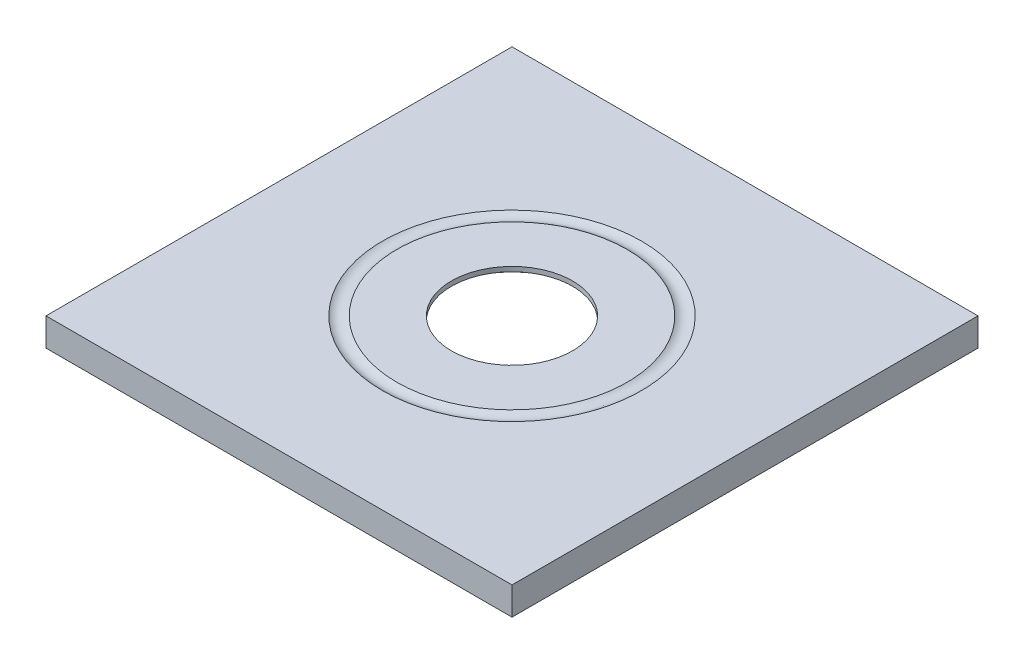
ISO-10303-21;
HEADER;
FILE_DESCRIPTION(('STEP AP214'),'2;1');
FILE_NAME('part.step','',(''),(''),'','','');
FILE_SCHEMA(('AUTOMOTIVE_DESIGN { 1 0 10303 214 1 1 1 1 }'));
ENDSEC;
DATA;
#1=APPLICATION_CONTEXT('core data for automotive mechanical design processes');
#2=APPLICATION_PROTOCOL_DEFINITION('international standard','automotive_design',2000,#1);
#3=PRODUCT_CONTEXT('',#1,'mechanical');
#4=PRODUCT('Part','Part','',(#3));
#5=PRODUCT_RELATED_PRODUCT_CATEGORY('part','',(#4));
#6=PRODUCT_DEFINITION_FORMATION('','',#4);
#7=PRODUCT_DEFINITION_CONTEXT('part definition',#1,'design');
#8=PRODUCT_DEFINITION('design','',#6,#7);
#9=PRODUCT_DEFINITION_SHAPE('','',#8);
#10=(LENGTH_UNIT() NAMED_UNIT(*) SI_UNIT(.MILLI.,.METRE.));
#11=(NAMED_UNIT(*) PLANE_ANGLE_UNIT() SI_UNIT($,.RADIAN.));
#12=(NAMED_UNIT(*) SI_UNIT($,.STERADIAN.) SOLID_ANGLE_UNIT());
#13=UNCERTAINTY_MEASURE_WITH_UNIT(LENGTH_MEASURE(1.E-05),#10,'distance_accuracy_value','');
#14=(GEOMETRIC_REPRESENTATION_CONTEXT(3) GLOBAL_UNCERTAINTY_ASSIGNED_CONTEXT((#13)) GLOBAL_UNIT_ASSIGNED_CONTEXT((#10,
#11,#12)) REPRESENTATION_CONTEXT('',''));
#15=CARTESIAN_POINT('',(0.,0.,0.));
#16=DIRECTION('',(0.,0.,1.));
#17=DIRECTION('',(1.,0.,0.));
#18=AXIS2_PLACEMENT_3D('',#15,#16,#17);
#19=CARTESIAN_POINT('',(0.,0.,0.));
#20=DIRECTION('',(0.,1.,0.));
#21=DIRECTION('',(0.,0.,1.));
#22=AXIS2_PLACEMENT_3D('',#19,#20,#21);
#23=CYLINDRICAL_SURFACE('',#22,40.);
#24=CARTESIAN_POINT('',(0.,-8.,0.));
#25=DIRECTION('',(0.,1.,0.));
#26=DIRECTION('',(0.,0.,1.));
#27=AXIS2_PLACEMENT_3D('',#24,#25,#26);
#28=CIRCLE('',#27,40.);
#29=CARTESIAN_POINT('',(0.,-8.,40.));
#30=VERTEX_POINT('',#29);
#31=EDGE_CURVE('E113',#30,#30,#28,.T.);
#32=ORIENTED_EDGE('',*,*,#31,.F.);
#33=EDGE_LOOP('',(#32));
#34=FACE_BOUND('',#33,.T.);
#35=CARTESIAN_POINT('',(1.69869538983426E-11,2.,-1.64294814736717E-11));
#36=DIRECTION('',(0.,1.,0.));
#37=DIRECTION('',(0.,0.,1.));
#38=AXIS2_PLACEMENT_3D('',#35,#36,#37);
#39=CIRCLE('',#38,40.0000000000173);
#40=CARTESIAN_POINT('',(1.69869538983426E-11,2.,40.0000000000009));
#41=VERTEX_POINT('',#40);
#42=EDGE_CURVE('E107',#41,#41,#39,.T.);
#43=ORIENTED_EDGE('',*,*,#42,.T.);
#44=EDGE_LOOP('',(#43));
#45=FACE_BOUND('',#44,.T.);
#46=ADVANCED_FACE('F34',(#34,#45),#23,.F.);
#47=CARTESIAN_POINT('',(49.4043,4.,0.));
#48=DIRECTION('',(0.,1.,0.));
#49=DIRECTION('',(0.,0.,1.));
#50=AXIS2_PLACEMENT_3D('',#47,#48,#49);
#51=PLANE('',#50);
#52=CARTESIAN_POINT('',(0.,4.,0.));
#53=DIRECTION('',(0.,1.,0.));
#54=DIRECTION('',(0.,0.,1.));
#55=AXIS2_PLACEMENT_3D('',#52,#53,#54);
#56=CIRCLE('',#55,49.4043);
#57=CARTESIAN_POINT('',(0.,4.,49.4043));
#58=VERTEX_POINT('',#57);
#59=EDGE_CURVE('E11',#58,#58,#56,.T.);
#60=ORIENTED_EDGE('',*,*,#59,.T.);
#61=EDGE_LOOP('',(#60));
#62=FACE_BOUND('',#61,.T.);
#63=CARTESIAN_POINT('',(1.69869538983426E-11,4.,-1.64294814736717E-11));
#64=DIRECTION('',(0.,1.,0.));
#65=DIRECTION('',(0.,0.,1.));
#66=AXIS2_PLACEMENT_3D('',#63,#64,#65);
#67=CIRCLE('',#66,26.);
#68=CARTESIAN_POINT('',(1.69869538983426E-11,4.,25.9999999999836));
#69=VERTEX_POINT('',#68);
#70=EDGE_CURVE('E245',#69,#69,#67,.T.);
#71=ORIENTED_EDGE('',*,*,#70,.F.);
#72=EDGE_LOOP('',(#71));
#73=FACE_BOUND('',#72,.T.);
#74=ADVANCED_FACE('F36',(#62,#73),#51,.T.);
#75=CARTESIAN_POINT('',(0.,8.11571883271926,0.));
#76=DIRECTION('',(0.,1.,0.));
#77=DIRECTION('',(0.,0.,1.));
#78=AXIS2_PLACEMENT_3D('',#75,#76,#77);
#79=TOROIDAL_SURFACE('',#78,52.5,5.15);
#80=CARTESIAN_POINT('',(0.,4.,0.));
#81=DIRECTION('',(0.,1.,0.));
#82=DIRECTION('',(0.,0.,1.));
#83=AXIS2_PLACEMENT_3D('',#80,#81,#82);
#84=CIRCLE('',#83,55.5957);
#85=CARTESIAN_POINT('',(0.,4.,55.5957));
#86=VERTEX_POINT('',#85);
#87=EDGE_CURVE('E43',#86,#86,#84,.T.);
#88=ORIENTED_EDGE('',*,*,#87,.T.);
#89=EDGE_LOOP('',(#88));
#90=FACE_BOUND('',#89,.T.);
#91=ORIENTED_EDGE('',*,*,#59,.F.);
#92=EDGE_LOOP('',(#91));
#93=FACE_BOUND('',#92,.T.);
#94=ADVANCED_FACE('F126',(#90,#93),#79,.F.);
#95=CARTESIAN_POINT('',(60.,4.,0.));
#96=DIRECTION('',(0.,1.,0.));
#97=DIRECTION('',(0.,0.,1.));
#98=AXIS2_PLACEMENT_3D('',#95,#96,#97);
#99=PLANE('',#98);
#100=ORIENTED_EDGE('',*,*,#87,.F.);
#101=EDGE_LOOP('',(#100));
#102=FACE_BOUND('',#101,.T.);
#103=DIRECTION('',(0.,0.,-1.));
#104=VECTOR('',#103,1.);
#105=CARTESIAN_POINT('',(100.,4.,-100.));
#106=LINE('',#105,#104);
#107=CARTESIAN_POINT('',(100.,4.,100.));
#108=VERTEX_POINT('',#107);
#109=CARTESIAN_POINT('',(100.,4.,-100.));
#110=VERTEX_POINT('',#109);
#111=EDGE_CURVE('E103',#108,#110,#106,.T.);
#112=ORIENTED_EDGE('',*,*,#111,.T.);
#113=DIRECTION('',(-1.,0.,0.));
#114=VECTOR('',#113,1.);
#115=CARTESIAN_POINT('',(-100.,4.,-100.));
#116=LINE('',#115,#114);
#117=CARTESIAN_POINT('',(-100.,4.,-100.));
#118=VERTEX_POINT('',#117);
#119=EDGE_CURVE('E106',#110,#118,#116,.T.);
#120=ORIENTED_EDGE('',*,*,#119,.T.);
#121=DIRECTION('',(0.,0.,1.));
#122=VECTOR('',#121,1.);
#123=CARTESIAN_POINT('',(-100.,4.,-100.));
#124=LINE('',#123,#122);
#125=CARTESIAN_POINT('',(-100.,4.,100.));
#126=VERTEX_POINT('',#125);
#127=EDGE_CURVE('E87',#118,#126,#124,.T.);
#128=ORIENTED_EDGE('',*,*,#127,.T.);
#129=DIRECTION('',(1.,0.,0.));
#130=VECTOR('',#129,1.);
#131=CARTESIAN_POINT('',(-100.,4.,100.));
#132=LINE('',#131,#130);
#133=EDGE_CURVE('E98',#126,#108,#132,.T.);
#134=ORIENTED_EDGE('',*,*,#133,.T.);
#135=EDGE_LOOP('',(#112,#120,#128,#134));
#136=FACE_BOUND('',#135,.T.);
#137=ADVANCED_FACE('F129',(#102,#136),#99,.T.);
#138=CARTESIAN_POINT('',(55.5957,-8.,0.));
#139=DIRECTION('',(0.,-1.,0.));
#140=DIRECTION('',(0.,0.,-1.));
#141=AXIS2_PLACEMENT_3D('',#138,#139,#140);
#142=PLANE('',#141);
#143=CARTESIAN_POINT('',(0.,-8.,0.));
#144=DIRECTION('',(0.,1.,0.));
#145=DIRECTION('',(0.,0.,1.));
#146=AXIS2_PLACEMENT_3D('',#143,#144,#145);
#147=CIRCLE('',#146,55.5957);
#148=CARTESIAN_POINT('',(0.,-8.,55.5957));
#149=VERTEX_POINT('',#148);
#150=EDGE_CURVE('E121',#149,#149,#147,.T.);
#151=ORIENTED_EDGE('',*,*,#150,.T.);
#152=EDGE_LOOP('',(#151));
#153=FACE_BOUND('',#152,.T.);
#154=DIRECTION('',(0.,0.,-1.));
#155=VECTOR('',#154,1.);
#156=CARTESIAN_POINT('',(100.,-8.,-100.));
#157=LINE('',#156,#155);
#158=CARTESIAN_POINT('',(100.,-8.,100.));
#159=VERTEX_POINT('',#158);
#160=CARTESIAN_POINT('',(100.,-8.,-100.));
#161=VERTEX_POINT('',#160);
#162=EDGE_CURVE('E96',#159,#161,#157,.T.);
#163=ORIENTED_EDGE('',*,*,#162,.F.);
#164=DIRECTION('',(1.,0.,0.));
#165=VECTOR('',#164,1.);
#166=CARTESIAN_POINT('',(-100.,-8.,100.));
#167=LINE('',#166,#165);
#168=CARTESIAN_POINT('',(-100.,-8.,100.));
#169=VERTEX_POINT('',#168);
#170=EDGE_CURVE('E93',#169,#159,#167,.T.);
#171=ORIENTED_EDGE('',*,*,#170,.F.);
#172=DIRECTION('',(0.,0.,1.));
#173=VECTOR('',#172,1.);
#174=CARTESIAN_POINT('',(-100.,-8.,-100.));
#175=LINE('',#174,#173);
#176=CARTESIAN_POINT('',(-100.,-8.,-100.));
#177=VERTEX_POINT('',#176);
#178=EDGE_CURVE('E85',#177,#169,#175,.T.);
#179=ORIENTED_EDGE('',*,*,#178,.F.);
#180=DIRECTION('',(-1.,0.,0.));
#181=VECTOR('',#180,1.);
#182=CARTESIAN_POINT('',(-100.,-8.,-100.));
#183=LINE('',#182,#181);
#184=EDGE_CURVE('E92',#161,#177,#183,.T.);
#185=ORIENTED_EDGE('',*,*,#184,.F.);
#186=EDGE_LOOP('',(#163,#171,#179,#185));
#187=FACE_BOUND('',#186,.T.);
#188=ADVANCED_FACE('F91',(#153,#187),#142,.T.);
#189=CARTESIAN_POINT('',(0.,-12.1157188327193,0.));
#190=DIRECTION('',(0.,1.,0.));
#191=DIRECTION('',(0.,0.,1.));
#192=AXIS2_PLACEMENT_3D('',#189,#190,#191);
#193=TOROIDAL_SURFACE('',#192,52.5,5.15);
#194=CARTESIAN_POINT('',(0.,-8.,0.));
#195=DIRECTION('',(0.,1.,0.));
#196=DIRECTION('',(0.,0.,1.));
#197=AXIS2_PLACEMENT_3D('',#194,#195,#196);
#198=CIRCLE('',#197,49.4043);
#199=CARTESIAN_POINT('',(0.,-8.,49.4043));
#200=VERTEX_POINT('',#199);
#201=EDGE_CURVE('E118',#200,#200,#198,.T.);
#202=ORIENTED_EDGE('',*,*,#201,.T.);
#203=EDGE_LOOP('',(#202));
#204=FACE_BOUND('',#203,.T.);
#205=ORIENTED_EDGE('',*,*,#150,.F.);
#206=EDGE_LOOP('',(#205));
#207=FACE_BOUND('',#206,.T.);
#208=ADVANCED_FACE('F158',(#204,#207),#193,.F.);
#209=CARTESIAN_POINT('',(40.,-8.,0.));
#210=DIRECTION('',(0.,-1.,0.));
#211=DIRECTION('',(0.,0.,-1.));
#212=AXIS2_PLACEMENT_3D('',#209,#210,#211);
#213=PLANE('',#212);
#214=ORIENTED_EDGE('',*,*,#31,.T.);
#215=EDGE_LOOP('',(#214));
#216=FACE_BOUND('',#215,.T.);
#217=ORIENTED_EDGE('',*,*,#201,.F.);
#218=EDGE_LOOP('',(#217));
#219=FACE_BOUND('',#218,.T.);
#220=ADVANCED_FACE('F142',(#216,#219),#213,.T.);
#221=CARTESIAN_POINT('',(100.,-8.,-100.));
#222=DIRECTION('',(1.,0.,0.));
#223=DIRECTION('',(0.,0.,-1.));
#224=AXIS2_PLACEMENT_3D('',#221,#222,#223);
#225=PLANE('',#224);
#226=ORIENTED_EDGE('',*,*,#111,.F.);
#227=DIRECTION('',(0.,1.,0.));
#228=VECTOR('',#227,1.);
#229=CARTESIAN_POINT('',(100.,-8.,100.));
#230=LINE('',#229,#228);
#231=EDGE_CURVE('E51',#159,#108,#230,.T.);
#232=ORIENTED_EDGE('',*,*,#231,.F.);
#233=ORIENTED_EDGE('',*,*,#162,.T.);
#234=DIRECTION('',(0.,1.,0.));
#235=VECTOR('',#234,1.);
#236=CARTESIAN_POINT('',(100.,-8.,-100.));
#237=LINE('',#236,#235);
#238=EDGE_CURVE('E79',#161,#110,#237,.T.);
#239=ORIENTED_EDGE('',*,*,#238,.T.);
#240=EDGE_LOOP('',(#226,#232,#233,#239));
#241=FACE_BOUND('',#240,.T.);
#242=ADVANCED_FACE('F133',(#241),#225,.T.);
#243=CARTESIAN_POINT('',(-100.,-8.,100.));
#244=DIRECTION('',(0.,0.,1.));
#245=DIRECTION('',(1.,0.,0.));
#246=AXIS2_PLACEMENT_3D('',#243,#244,#245);
#247=PLANE('',#246);
#248=ORIENTED_EDGE('',*,*,#133,.F.);
#249=DIRECTION('',(0.,1.,0.));
#250=VECTOR('',#249,1.);
#251=CARTESIAN_POINT('',(-100.,-8.,100.));
#252=LINE('',#251,#250);
#253=EDGE_CURVE('E68',#169,#126,#252,.T.);
#254=ORIENTED_EDGE('',*,*,#253,.F.);
#255=ORIENTED_EDGE('',*,*,#170,.T.);
#256=ORIENTED_EDGE('',*,*,#231,.T.);
#257=EDGE_LOOP('',(#248,#254,#255,#256));
#258=FACE_BOUND('',#257,.T.);
#259=ADVANCED_FACE('F134',(#258),#247,.T.);
#260=CARTESIAN_POINT('',(-100.,-8.,-100.));
#261=DIRECTION('',(-1.,0.,0.));
#262=DIRECTION('',(0.,0.,1.));
#263=AXIS2_PLACEMENT_3D('',#260,#261,#262);
#264=PLANE('',#263);
#265=ORIENTED_EDGE('',*,*,#127,.F.);
#266=DIRECTION('',(0.,1.,0.));
#267=VECTOR('',#266,1.);
#268=CARTESIAN_POINT('',(-100.,-8.,-100.));
#269=LINE('',#268,#267);
#270=EDGE_CURVE('E82',#177,#118,#269,.T.);
#271=ORIENTED_EDGE('',*,*,#270,.F.);
#272=ORIENTED_EDGE('',*,*,#178,.T.);
#273=ORIENTED_EDGE('',*,*,#253,.T.);
#274=EDGE_LOOP('',(#265,#271,#272,#273));
#275=FACE_BOUND('',#274,.T.);
#276=ADVANCED_FACE('F84',(#275),#264,.T.);
#277=CARTESIAN_POINT('',(-100.,-8.,-100.));
#278=DIRECTION('',(0.,0.,-1.));
#279=DIRECTION('',(-1.,0.,0.));
#280=AXIS2_PLACEMENT_3D('',#277,#278,#279);
#281=PLANE('',#280);
#282=ORIENTED_EDGE('',*,*,#119,.F.);
#283=ORIENTED_EDGE('',*,*,#238,.F.);
#284=ORIENTED_EDGE('',*,*,#184,.T.);
#285=ORIENTED_EDGE('',*,*,#270,.T.);
#286=EDGE_LOOP('',(#282,#283,#284,#285));
#287=FACE_BOUND('',#286,.T.);
#288=ADVANCED_FACE('F95',(#287),#281,.T.);
#289=CARTESIAN_POINT('',(1.69869538983426E-11,2.,-1.64294814736717E-11));
#290=DIRECTION('',(0.,1.,0.));
#291=DIRECTION('',(0.,0.,1.));
#292=AXIS2_PLACEMENT_3D('',#289,#290,#291);
#293=PLANE('',#292);
#294=CARTESIAN_POINT('',(1.69869538983426E-11,2.,-1.64294814736717E-11));
#295=DIRECTION('',(0.,1.,0.));
#296=DIRECTION('',(0.,0.,1.));
#297=AXIS2_PLACEMENT_3D('',#294,#295,#296);
#298=CIRCLE('',#297,26.);
#299=CARTESIAN_POINT('',(1.69869538983426E-11,2.,25.9999999999836));
#300=VERTEX_POINT('',#299);
#301=EDGE_CURVE('E242',#300,#300,#298,.T.);
#302=ORIENTED_EDGE('',*,*,#301,.T.);
#303=EDGE_LOOP('',(#302));
#304=FACE_BOUND('',#303,.T.);
#305=ORIENTED_EDGE('',*,*,#42,.F.);
#306=EDGE_LOOP('',(#305));
#307=FACE_BOUND('',#306,.T.);
#308=ADVANCED_FACE('F208',(#304,#307),#293,.F.);
#309=CARTESIAN_POINT('',(1.69869538983426E-11,2.,-1.64294814736717E-11));
#310=DIRECTION('',(0.,1.,0.));
#311=DIRECTION('',(0.,0.,1.));
#312=AXIS2_PLACEMENT_3D('',#309,#310,#311);
#313=CYLINDRICAL_SURFACE('',#312,26.);
#314=ORIENTED_EDGE('',*,*,#301,.F.);
#315=EDGE_LOOP('',(#314));
#316=FACE_BOUND('',#315,.T.);
#317=ORIENTED_EDGE('',*,*,#70,.T.);
#318=EDGE_LOOP('',(#317));
#319=FACE_BOUND('',#318,.T.);
#320=ADVANCED_FACE('F226',(#316,#319),#313,.F.);
#321=CLOSED_SHELL('',(#46,#74,#94,#137,#188,#208,#220,#242,#259,#276,#288,#308,#320));
#322=MANIFOLD_SOLID_BREP('B2',#321);
#323=ADVANCED_BREP_SHAPE_REPRESENTATION('',(#18,#322),#14);
#324=SHAPE_DEFINITION_REPRESENTATION(#9,#323);
ENDSEC;
END-ISO-10303-21;
